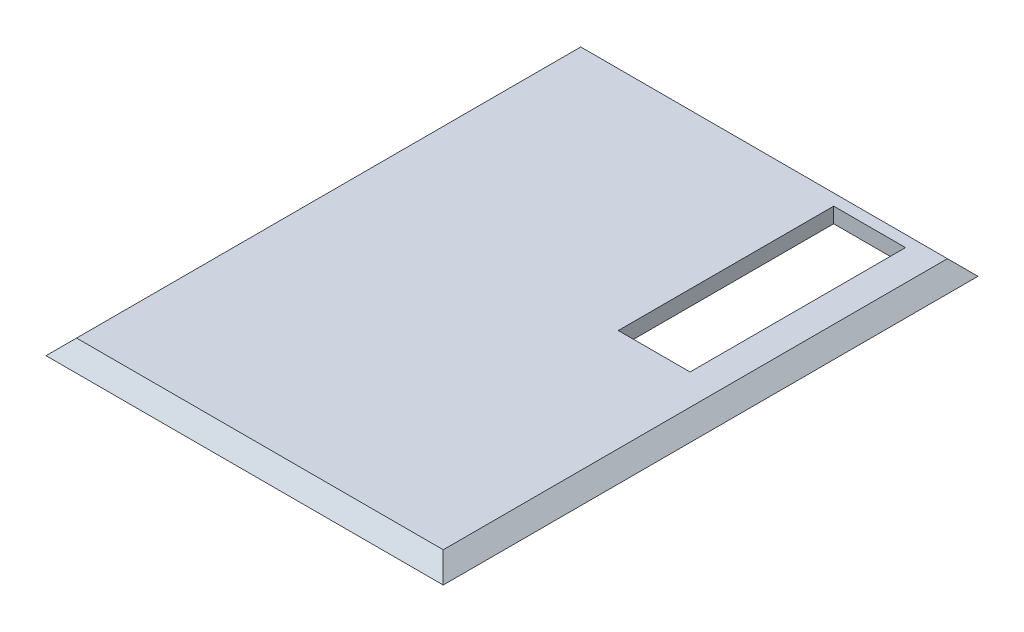
ISO-10303-21;
HEADER;
FILE_DESCRIPTION(('STEP AP214'),'2;1');
FILE_NAME('part.step','',(''),(''),'','','');
FILE_SCHEMA(('AUTOMOTIVE_DESIGN { 1 0 10303 214 1 1 1 1 }'));
ENDSEC;
DATA;
#1=APPLICATION_CONTEXT('core data for automotive mechanical design processes');
#2=APPLICATION_PROTOCOL_DEFINITION('international standard','automotive_design',2000,#1);
#3=PRODUCT_CONTEXT('',#1,'mechanical');
#4=PRODUCT('Part','Part','',(#3));
#5=PRODUCT_RELATED_PRODUCT_CATEGORY('part','',(#4));
#6=PRODUCT_DEFINITION_FORMATION('','',#4);
#7=PRODUCT_DEFINITION_CONTEXT('part definition',#1,'design');
#8=PRODUCT_DEFINITION('design','',#6,#7);
#9=PRODUCT_DEFINITION_SHAPE('','',#8);
#10=(LENGTH_UNIT() NAMED_UNIT(*) SI_UNIT(.MILLI.,.METRE.));
#11=(NAMED_UNIT(*) PLANE_ANGLE_UNIT() SI_UNIT($,.RADIAN.));
#12=(NAMED_UNIT(*) SI_UNIT($,.STERADIAN.) SOLID_ANGLE_UNIT());
#13=UNCERTAINTY_MEASURE_WITH_UNIT(LENGTH_MEASURE(1.E-05),#10,'distance_accuracy_value','');
#14=(GEOMETRIC_REPRESENTATION_CONTEXT(3) GLOBAL_UNCERTAINTY_ASSIGNED_CONTEXT((#13)) GLOBAL_UNIT_ASSIGNED_CONTEXT((#10,
#11,#12)) REPRESENTATION_CONTEXT('',''));
#15=CARTESIAN_POINT('',(0.,0.,0.));
#16=DIRECTION('',(0.,0.,1.));
#17=DIRECTION('',(1.,0.,0.));
#18=AXIS2_PLACEMENT_3D('',#15,#16,#17);
#19=CARTESIAN_POINT('',(0.,0.,0.));
#20=DIRECTION('',(0.,-1.,0.));
#21=DIRECTION('',(0.,0.,-1.));
#22=AXIS2_PLACEMENT_3D('',#19,#20,#21);
#23=PLANE('',#22);
#24=DIRECTION('',(0.,0.,-1.));
#25=VECTOR('',#24,1.);
#26=CARTESIAN_POINT('',(65.,0.,87.5));
#27=LINE('',#26,#25);
#28=CARTESIAN_POINT('',(65.,0.,87.5));
#29=VERTEX_POINT('',#28);
#30=CARTESIAN_POINT('',(65.,0.,-87.5));
#31=VERTEX_POINT('',#30);
#32=EDGE_CURVE('E218',#29,#31,#27,.T.);
#33=ORIENTED_EDGE('',*,*,#32,.F.);
#34=DIRECTION('',(1.,0.,0.));
#35=VECTOR('',#34,1.);
#36=CARTESIAN_POINT('',(-65.,0.,87.5));
#37=LINE('',#36,#35);
#38=CARTESIAN_POINT('',(-65.,0.,87.5));
#39=VERTEX_POINT('',#38);
#40=EDGE_CURVE('E228',#39,#29,#37,.T.);
#41=ORIENTED_EDGE('',*,*,#40,.F.);
#42=DIRECTION('',(0.,0.,1.));
#43=VECTOR('',#42,1.);
#44=CARTESIAN_POINT('',(-65.,0.,87.5));
#45=LINE('',#44,#43);
#46=CARTESIAN_POINT('',(-65.,0.,-87.5));
#47=VERTEX_POINT('',#46);
#48=EDGE_CURVE('E225',#47,#39,#45,.T.);
#49=ORIENTED_EDGE('',*,*,#48,.F.);
#50=DIRECTION('',(-1.,0.,0.));
#51=VECTOR('',#50,1.);
#52=CARTESIAN_POINT('',(-65.,0.,-87.5));
#53=LINE('',#52,#51);
#54=EDGE_CURVE('E221',#31,#47,#53,.T.);
#55=ORIENTED_EDGE('',*,*,#54,.F.);
#56=EDGE_LOOP('',(#33,#41,#49,#55));
#57=FACE_BOUND('',#56,.T.);
#58=DIRECTION('',(-1.,0.,0.));
#59=VECTOR('',#58,1.);
#60=CARTESIAN_POINT('',(0.,0.,-5.));
#61=LINE('',#60,#59);
#62=CARTESIAN_POINT('',(0.5,0.,-5.));
#63=VERTEX_POINT('',#62);
#64=CARTESIAN_POINT('',(-0.5,0.,-5.));
#65=VERTEX_POINT('',#64);
#66=EDGE_CURVE('E211',#63,#65,#61,.T.);
#67=ORIENTED_EDGE('',*,*,#66,.T.);
#68=CARTESIAN_POINT('',(-0.5,0.,-4.));
#69=DIRECTION('',(0.,-1.,0.));
#70=DIRECTION('',(0.,0.,-1.));
#71=AXIS2_PLACEMENT_3D('',#68,#69,#70);
#72=CIRCLE('',#71,1.);
#73=CARTESIAN_POINT('',(-1.5,0.,-4.));
#74=VERTEX_POINT('',#73);
#75=EDGE_CURVE('E310',#65,#74,#72,.F.);
#76=ORIENTED_EDGE('',*,*,#75,.T.);
#77=DIRECTION('',(0.,0.,1.));
#78=VECTOR('',#77,1.);
#79=CARTESIAN_POINT('',(-1.5,0.,0.));
#80=LINE('',#79,#78);
#81=CARTESIAN_POINT('',(-1.5,0.,4.));
#82=VERTEX_POINT('',#81);
#83=EDGE_CURVE('E207',#74,#82,#80,.T.);
#84=ORIENTED_EDGE('',*,*,#83,.T.);
#85=CARTESIAN_POINT('',(-0.5,0.,4.));
#86=DIRECTION('',(0.,-1.,0.));
#87=DIRECTION('',(0.,0.,-1.));
#88=AXIS2_PLACEMENT_3D('',#85,#86,#87);
#89=CIRCLE('',#88,1.);
#90=CARTESIAN_POINT('',(-0.5,0.,5.));
#91=VERTEX_POINT('',#90);
#92=EDGE_CURVE('E52',#82,#91,#89,.F.);
#93=ORIENTED_EDGE('',*,*,#92,.T.);
#94=DIRECTION('',(-1.,0.,0.));
#95=VECTOR('',#94,1.);
#96=CARTESIAN_POINT('',(0.,0.,5.));
#97=LINE('',#96,#95);
#98=CARTESIAN_POINT('',(0.5,0.,5.));
#99=VERTEX_POINT('',#98);
#100=EDGE_CURVE('E204',#99,#91,#97,.T.);
#101=ORIENTED_EDGE('',*,*,#100,.F.);
#102=CARTESIAN_POINT('',(0.5,0.,4.));
#103=DIRECTION('',(0.,-1.,0.));
#104=DIRECTION('',(0.,0.,-1.));
#105=AXIS2_PLACEMENT_3D('',#102,#103,#104);
#106=CIRCLE('',#105,1.);
#107=CARTESIAN_POINT('',(1.5,0.,4.));
#108=VERTEX_POINT('',#107);
#109=EDGE_CURVE('E11',#99,#108,#106,.F.);
#110=ORIENTED_EDGE('',*,*,#109,.T.);
#111=DIRECTION('',(0.,0.,1.));
#112=VECTOR('',#111,1.);
#113=CARTESIAN_POINT('',(1.5,0.,0.));
#114=LINE('',#113,#112);
#115=CARTESIAN_POINT('',(1.5,0.,-4.));
#116=VERTEX_POINT('',#115);
#117=EDGE_CURVE('E214',#116,#108,#114,.T.);
#118=ORIENTED_EDGE('',*,*,#117,.F.);
#119=CARTESIAN_POINT('',(0.5,0.,-4.));
#120=DIRECTION('',(0.,-1.,0.));
#121=DIRECTION('',(0.,0.,-1.));
#122=AXIS2_PLACEMENT_3D('',#119,#120,#121);
#123=CIRCLE('',#122,1.);
#124=EDGE_CURVE('E308',#116,#63,#123,.F.);
#125=ORIENTED_EDGE('',*,*,#124,.T.);
#126=EDGE_LOOP('',(#67,#76,#84,#93,#101,#110,#118,#125));
#127=FACE_BOUND('',#126,.T.);
#128=DIRECTION('',(0.,0.,-1.));
#129=VECTOR('',#128,1.);
#130=CARTESIAN_POINT('',(50.,0.,0.));
#131=LINE('',#130,#129);
#132=CARTESIAN_POINT('',(50.,0.,-8.275));
#133=VERTEX_POINT('',#132);
#134=CARTESIAN_POINT('',(50.,0.,-78.775));
#135=VERTEX_POINT('',#134);
#136=EDGE_CURVE('E195',#133,#135,#131,.T.);
#137=ORIENTED_EDGE('',*,*,#136,.T.);
#138=DIRECTION('',(-1.,0.,0.));
#139=VECTOR('',#138,1.);
#140=CARTESIAN_POINT('',(0.,0.,-78.775));
#141=LINE('',#140,#139);
#142=CARTESIAN_POINT('',(26.5,0.,-78.775));
#143=VERTEX_POINT('',#142);
#144=EDGE_CURVE('E60',#135,#143,#141,.T.);
#145=ORIENTED_EDGE('',*,*,#144,.T.);
#146=DIRECTION('',(0.,0.,-1.));
#147=VECTOR('',#146,1.);
#148=CARTESIAN_POINT('',(26.5,0.,0.));
#149=LINE('',#148,#147);
#150=CARTESIAN_POINT('',(26.5,0.,-8.275));
#151=VERTEX_POINT('',#150);
#152=EDGE_CURVE('E186',#151,#143,#149,.T.);
#153=ORIENTED_EDGE('',*,*,#152,.F.);
#154=DIRECTION('',(-1.,0.,0.));
#155=VECTOR('',#154,1.);
#156=CARTESIAN_POINT('',(0.,0.,-8.27500000000001));
#157=LINE('',#156,#155);
#158=EDGE_CURVE('E189',#133,#151,#157,.T.);
#159=ORIENTED_EDGE('',*,*,#158,.F.);
#160=EDGE_LOOP('',(#137,#145,#153,#159));
#161=FACE_BOUND('',#160,.T.);
#162=ADVANCED_FACE('F43',(#57,#127,#161),#23,.T.);
#163=CARTESIAN_POINT('',(0.,5.,0.));
#164=DIRECTION('',(0.,-1.,0.));
#165=DIRECTION('',(0.,0.,-1.));
#166=AXIS2_PLACEMENT_3D('',#163,#164,#165);
#167=PLANE('',#166);
#168=DIRECTION('',(1.,0.,0.));
#169=VECTOR('',#168,1.);
#170=CARTESIAN_POINT('',(0.,5.,82.5));
#171=LINE('',#170,#169);
#172=CARTESIAN_POINT('',(-60.,5.,82.5));
#173=VERTEX_POINT('',#172);
#174=CARTESIAN_POINT('',(60.,5.,82.5));
#175=VERTEX_POINT('',#174);
#176=EDGE_CURVE('E231',#173,#175,#171,.T.);
#177=ORIENTED_EDGE('',*,*,#176,.T.);
#178=DIRECTION('',(0.,0.,-1.));
#179=VECTOR('',#178,1.);
#180=CARTESIAN_POINT('',(60.,5.,0.));
#181=LINE('',#180,#179);
#182=CARTESIAN_POINT('',(60.,5.,-82.5));
#183=VERTEX_POINT('',#182);
#184=EDGE_CURVE('E237',#175,#183,#181,.T.);
#185=ORIENTED_EDGE('',*,*,#184,.T.);
#186=DIRECTION('',(-1.,0.,0.));
#187=VECTOR('',#186,1.);
#188=CARTESIAN_POINT('',(0.,5.,-82.5));
#189=LINE('',#188,#187);
#190=CARTESIAN_POINT('',(-60.,5.,-82.5));
#191=VERTEX_POINT('',#190);
#192=EDGE_CURVE('E235',#183,#191,#189,.T.);
#193=ORIENTED_EDGE('',*,*,#192,.T.);
#194=DIRECTION('',(0.,0.,1.));
#195=VECTOR('',#194,1.);
#196=CARTESIAN_POINT('',(-60.,5.,0.));
#197=LINE('',#196,#195);
#198=EDGE_CURVE('E233',#191,#173,#197,.T.);
#199=ORIENTED_EDGE('',*,*,#198,.T.);
#200=EDGE_LOOP('',(#177,#185,#193,#199));
#201=FACE_BOUND('',#200,.T.);
#202=DIRECTION('',(-1.,0.,0.));
#203=VECTOR('',#202,1.);
#204=CARTESIAN_POINT('',(0.,5.,-78.775));
#205=LINE('',#204,#203);
#206=CARTESIAN_POINT('',(50.,5.,-78.775));
#207=VERTEX_POINT('',#206);
#208=CARTESIAN_POINT('',(26.5,5.,-78.775));
#209=VERTEX_POINT('',#208);
#210=EDGE_CURVE('E177',#207,#209,#205,.T.);
#211=ORIENTED_EDGE('',*,*,#210,.F.);
#212=DIRECTION('',(0.,0.,-1.));
#213=VECTOR('',#212,1.);
#214=CARTESIAN_POINT('',(50.,5.,0.));
#215=LINE('',#214,#213);
#216=CARTESIAN_POINT('',(50.,5.,-8.275));
#217=VERTEX_POINT('',#216);
#218=EDGE_CURVE('E169',#217,#207,#215,.T.);
#219=ORIENTED_EDGE('',*,*,#218,.F.);
#220=DIRECTION('',(-1.,0.,0.));
#221=VECTOR('',#220,1.);
#222=CARTESIAN_POINT('',(0.,5.,-8.27500000000001));
#223=LINE('',#222,#221);
#224=CARTESIAN_POINT('',(26.5,5.,-8.275));
#225=VERTEX_POINT('',#224);
#226=EDGE_CURVE('E68',#217,#225,#223,.T.);
#227=ORIENTED_EDGE('',*,*,#226,.T.);
#228=DIRECTION('',(0.,0.,-1.));
#229=VECTOR('',#228,1.);
#230=CARTESIAN_POINT('',(26.5,5.,0.));
#231=LINE('',#230,#229);
#232=EDGE_CURVE('E181',#225,#209,#231,.T.);
#233=ORIENTED_EDGE('',*,*,#232,.T.);
#234=EDGE_LOOP('',(#211,#219,#227,#233));
#235=FACE_BOUND('',#234,.T.);
#236=ADVANCED_FACE('F184',(#201,#235),#167,.F.);
#237=CARTESIAN_POINT('',(-60.,5.,0.));
#238=DIRECTION('',(0.707106781186549,-0.707106781186546,0.));
#239=DIRECTION('',(0.,0.,1.));
#240=AXIS2_PLACEMENT_3D('',#237,#238,#239);
#241=PLANE('',#240);
#242=DIRECTION('',(-0.577350269189625,-0.577350269189628,-0.577350269189625));
#243=VECTOR('',#242,1.);
#244=CARTESIAN_POINT('',(-32.5000000000001,32.5000000000001,-55.0000000000001));
#245=LINE('',#244,#243);
#246=EDGE_CURVE('E244',#47,#191,#245,.F.);
#247=ORIENTED_EDGE('',*,*,#246,.F.);
#248=ORIENTED_EDGE('',*,*,#48,.T.);
#249=DIRECTION('',(-0.577350269189625,-0.577350269189628,0.577350269189625));
#250=VECTOR('',#249,1.);
#251=CARTESIAN_POINT('',(-40.0000000000001,25.,62.5000000000001));
#252=LINE('',#251,#250);
#253=EDGE_CURVE('E222',#173,#39,#252,.T.);
#254=ORIENTED_EDGE('',*,*,#253,.F.);
#255=ORIENTED_EDGE('',*,*,#198,.F.);
#256=EDGE_LOOP('',(#247,#248,#254,#255));
#257=FACE_BOUND('',#256,.T.);
#258=ADVANCED_FACE('F401',(#257),#241,.F.);
#259=CARTESIAN_POINT('',(0.,5.,82.5));
#260=DIRECTION('',(0.,-0.707106781186546,-0.707106781186549));
#261=DIRECTION('',(1.,0.,0.));
#262=AXIS2_PLACEMENT_3D('',#259,#260,#261);
#263=PLANE('',#262);
#264=ORIENTED_EDGE('',*,*,#253,.T.);
#265=ORIENTED_EDGE('',*,*,#40,.T.);
#266=DIRECTION('',(-0.577350269189625,0.577350269189628,-0.577350269189625));
#267=VECTOR('',#266,1.);
#268=CARTESIAN_POINT('',(40.0000000000001,25.,62.5000000000001));
#269=LINE('',#268,#267);
#270=EDGE_CURVE('E242',#175,#29,#269,.F.);
#271=ORIENTED_EDGE('',*,*,#270,.F.);
#272=ORIENTED_EDGE('',*,*,#176,.F.);
#273=EDGE_LOOP('',(#264,#265,#271,#272));
#274=FACE_BOUND('',#273,.T.);
#275=ADVANCED_FACE('F419',(#274),#263,.F.);
#276=CARTESIAN_POINT('',(0.,5.,-82.5));
#277=DIRECTION('',(0.,-0.707106781186546,0.707106781186549));
#278=DIRECTION('',(-1.,0.,0.));
#279=AXIS2_PLACEMENT_3D('',#276,#277,#278);
#280=PLANE('',#279);
#281=ORIENTED_EDGE('',*,*,#246,.T.);
#282=ORIENTED_EDGE('',*,*,#192,.F.);
#283=DIRECTION('',(0.577350269189625,-0.577350269189628,-0.577350269189625));
#284=VECTOR('',#283,1.);
#285=CARTESIAN_POINT('',(40.0000000000001,25.,-62.5000000000001));
#286=LINE('',#285,#284);
#287=EDGE_CURVE('E217',#31,#183,#286,.F.);
#288=ORIENTED_EDGE('',*,*,#287,.F.);
#289=ORIENTED_EDGE('',*,*,#54,.T.);
#290=EDGE_LOOP('',(#281,#282,#288,#289));
#291=FACE_BOUND('',#290,.T.);
#292=ADVANCED_FACE('F412',(#291),#280,.F.);
#293=CARTESIAN_POINT('',(60.,5.,0.));
#294=DIRECTION('',(-0.707106781186549,-0.707106781186546,0.));
#295=DIRECTION('',(0.,0.,-1.));
#296=AXIS2_PLACEMENT_3D('',#293,#294,#295);
#297=PLANE('',#296);
#298=ORIENTED_EDGE('',*,*,#270,.T.);
#299=ORIENTED_EDGE('',*,*,#32,.T.);
#300=ORIENTED_EDGE('',*,*,#287,.T.);
#301=ORIENTED_EDGE('',*,*,#184,.F.);
#302=EDGE_LOOP('',(#298,#299,#300,#301));
#303=FACE_BOUND('',#302,.T.);
#304=ADVANCED_FACE('F393',(#303),#297,.F.);
#305=CARTESIAN_POINT('',(0.,-5.,5.));
#306=DIRECTION('',(0.,0.,-1.));
#307=DIRECTION('',(-1.,0.,0.));
#308=AXIS2_PLACEMENT_3D('',#305,#306,#307);
#309=PLANE('',#308);
#310=ORIENTED_EDGE('',*,*,#100,.T.);
#311=DIRECTION('',(0.,1.,0.));
#312=VECTOR('',#311,1.);
#313=CARTESIAN_POINT('',(-0.5,-4.,5.));
#314=LINE('',#313,#312);
#315=CARTESIAN_POINT('',(-0.5,-4.,5.));
#316=VERTEX_POINT('',#315);
#317=EDGE_CURVE('E306',#91,#316,#314,.F.);
#318=ORIENTED_EDGE('',*,*,#317,.T.);
#319=DIRECTION('',(-1.,0.,0.));
#320=VECTOR('',#319,1.);
#321=CARTESIAN_POINT('',(1.5,-4.,5.));
#322=LINE('',#321,#320);
#323=CARTESIAN_POINT('',(0.5,-4.,5.));
#324=VERTEX_POINT('',#323);
#325=EDGE_CURVE('E269',#316,#324,#322,.F.);
#326=ORIENTED_EDGE('',*,*,#325,.T.);
#327=DIRECTION('',(0.,1.,0.));
#328=VECTOR('',#327,1.);
#329=CARTESIAN_POINT('',(0.5,-5.,5.));
#330=LINE('',#329,#328);
#331=EDGE_CURVE('E304',#324,#99,#330,.T.);
#332=ORIENTED_EDGE('',*,*,#331,.T.);
#333=EDGE_LOOP('',(#310,#318,#326,#332));
#334=FACE_BOUND('',#333,.T.);
#335=ADVANCED_FACE('F331',(#334),#309,.F.);
#336=CARTESIAN_POINT('',(-1.5,-5.,0.));
#337=DIRECTION('',(-1.,0.,0.));
#338=DIRECTION('',(0.,0.,1.));
#339=AXIS2_PLACEMENT_3D('',#336,#337,#338);
#340=PLANE('',#339);
#341=ORIENTED_EDGE('',*,*,#83,.F.);
#342=DIRECTION('',(0.,1.,0.));
#343=VECTOR('',#342,1.);
#344=CARTESIAN_POINT('',(-1.5,-5.,-4.));
#345=LINE('',#344,#343);
#346=CARTESIAN_POINT('',(-1.5,-4.,-4.));
#347=VERTEX_POINT('',#346);
#348=EDGE_CURVE('E302',#74,#347,#345,.F.);
#349=ORIENTED_EDGE('',*,*,#348,.T.);
#350=DIRECTION('',(0.,0.,1.));
#351=VECTOR('',#350,1.);
#352=CARTESIAN_POINT('',(-1.5,-4.,0.));
#353=LINE('',#352,#351);
#354=CARTESIAN_POINT('',(-1.5,-4.,4.));
#355=VERTEX_POINT('',#354);
#356=EDGE_CURVE('E266',#347,#355,#353,.T.);
#357=ORIENTED_EDGE('',*,*,#356,.T.);
#358=DIRECTION('',(0.,1.,0.));
#359=VECTOR('',#358,1.);
#360=CARTESIAN_POINT('',(-1.5,0.,4.));
#361=LINE('',#360,#359);
#362=EDGE_CURVE('E300',#355,#82,#361,.T.);
#363=ORIENTED_EDGE('',*,*,#362,.T.);
#364=EDGE_LOOP('',(#341,#349,#357,#363));
#365=FACE_BOUND('',#364,.T.);
#366=ADVANCED_FACE('F385',(#365),#340,.T.);
#367=CARTESIAN_POINT('',(0.,-5.,-5.));
#368=DIRECTION('',(0.,0.,-1.));
#369=DIRECTION('',(-1.,0.,0.));
#370=AXIS2_PLACEMENT_3D('',#367,#368,#369);
#371=PLANE('',#370);
#372=ORIENTED_EDGE('',*,*,#66,.F.);
#373=DIRECTION('',(0.,1.,0.));
#374=VECTOR('',#373,1.);
#375=CARTESIAN_POINT('',(0.5,-4.,-5.));
#376=LINE('',#375,#374);
#377=CARTESIAN_POINT('',(0.5,-4.,-5.));
#378=VERTEX_POINT('',#377);
#379=EDGE_CURVE('E298',#63,#378,#376,.F.);
#380=ORIENTED_EDGE('',*,*,#379,.T.);
#381=DIRECTION('',(-1.,0.,0.));
#382=VECTOR('',#381,1.);
#383=CARTESIAN_POINT('',(0.,-4.,-5.));
#384=LINE('',#383,#382);
#385=CARTESIAN_POINT('',(-0.5,-4.,-5.));
#386=VERTEX_POINT('',#385);
#387=EDGE_CURVE('E263',#378,#386,#384,.T.);
#388=ORIENTED_EDGE('',*,*,#387,.T.);
#389=DIRECTION('',(0.,1.,0.));
#390=VECTOR('',#389,1.);
#391=CARTESIAN_POINT('',(-0.5,-5.,-5.));
#392=LINE('',#391,#390);
#393=EDGE_CURVE('E296',#386,#65,#392,.T.);
#394=ORIENTED_EDGE('',*,*,#393,.T.);
#395=EDGE_LOOP('',(#372,#380,#388,#394));
#396=FACE_BOUND('',#395,.T.);
#397=ADVANCED_FACE('F368',(#396),#371,.T.);
#398=CARTESIAN_POINT('',(1.5,-5.,0.));
#399=DIRECTION('',(-1.,0.,0.));
#400=DIRECTION('',(0.,0.,1.));
#401=AXIS2_PLACEMENT_3D('',#398,#399,#400);
#402=PLANE('',#401);
#403=DIRECTION('',(0.,0.,1.));
#404=VECTOR('',#403,1.);
#405=CARTESIAN_POINT('',(1.5,-4.,-5.));
#406=LINE('',#405,#404);
#407=CARTESIAN_POINT('',(1.5,-4.,4.));
#408=VERTEX_POINT('',#407);
#409=CARTESIAN_POINT('',(1.5,-4.,-4.));
#410=VERTEX_POINT('',#409);
#411=EDGE_CURVE('E260',#408,#410,#406,.F.);
#412=ORIENTED_EDGE('',*,*,#411,.T.);
#413=DIRECTION('',(0.,1.,0.));
#414=VECTOR('',#413,1.);
#415=CARTESIAN_POINT('',(1.5,0.,-4.));
#416=LINE('',#415,#414);
#417=EDGE_CURVE('E294',#410,#116,#416,.T.);
#418=ORIENTED_EDGE('',*,*,#417,.T.);
#419=ORIENTED_EDGE('',*,*,#117,.T.);
#420=DIRECTION('',(0.,1.,0.));
#421=VECTOR('',#420,1.);
#422=CARTESIAN_POINT('',(1.5,-5.,4.));
#423=LINE('',#422,#421);
#424=EDGE_CURVE('E292',#108,#408,#423,.F.);
#425=ORIENTED_EDGE('',*,*,#424,.T.);
#426=EDGE_LOOP('',(#412,#418,#419,#425));
#427=FACE_BOUND('',#426,.T.);
#428=ADVANCED_FACE('F364',(#427),#402,.F.);
#429=CARTESIAN_POINT('',(0.,-5.,0.));
#430=DIRECTION('',(0.,-1.,0.));
#431=DIRECTION('',(0.,0.,-1.));
#432=AXIS2_PLACEMENT_3D('',#429,#430,#431);
#433=PLANE('',#432);
#434=DIRECTION('',(-1.,0.,0.));
#435=VECTOR('',#434,1.);
#436=CARTESIAN_POINT('',(0.,-5.,-4.));
#437=LINE('',#436,#435);
#438=CARTESIAN_POINT('',(-0.5,-5.,-4.));
#439=VERTEX_POINT('',#438);
#440=CARTESIAN_POINT('',(0.5,-5.,-4.));
#441=VERTEX_POINT('',#440);
#442=EDGE_CURVE('E254',#439,#441,#437,.F.);
#443=ORIENTED_EDGE('',*,*,#442,.T.);
#444=DIRECTION('',(0.,0.,1.));
#445=VECTOR('',#444,1.);
#446=CARTESIAN_POINT('',(0.5,-5.,5.));
#447=LINE('',#446,#445);
#448=CARTESIAN_POINT('',(0.5,-5.,4.));
#449=VERTEX_POINT('',#448);
#450=EDGE_CURVE('E257',#441,#449,#447,.T.);
#451=ORIENTED_EDGE('',*,*,#450,.T.);
#452=DIRECTION('',(-1.,0.,0.));
#453=VECTOR('',#452,1.);
#454=CARTESIAN_POINT('',(-1.5,-5.,4.));
#455=LINE('',#454,#453);
#456=CARTESIAN_POINT('',(-0.5,-5.,4.));
#457=VERTEX_POINT('',#456);
#458=EDGE_CURVE('E240',#449,#457,#455,.T.);
#459=ORIENTED_EDGE('',*,*,#458,.T.);
#460=DIRECTION('',(0.,0.,1.));
#461=VECTOR('',#460,1.);
#462=CARTESIAN_POINT('',(-0.5,-5.,0.));
#463=LINE('',#462,#461);
#464=EDGE_CURVE('E251',#457,#439,#463,.F.);
#465=ORIENTED_EDGE('',*,*,#464,.T.);
#466=EDGE_LOOP('',(#443,#451,#459,#465));
#467=FACE_BOUND('',#466,.T.);
#468=ADVANCED_FACE('F348',(#467),#433,.T.);
#469=CARTESIAN_POINT('',(-0.5,-4.,0.));
#470=DIRECTION('',(0.,0.,1.));
#471=DIRECTION('',(1.,0.,0.));
#472=AXIS2_PLACEMENT_3D('',#469,#470,#471);
#473=CYLINDRICAL_SURFACE('',#472,1.);
#474=ORIENTED_EDGE('',*,*,#356,.F.);
#475=CARTESIAN_POINT('',(-0.5,-4.,-4.));
#476=DIRECTION('',(0.,0.,1.));
#477=DIRECTION('',(1.,0.,0.));
#478=AXIS2_PLACEMENT_3D('',#475,#476,#477);
#479=CIRCLE('',#478,1.);
#480=EDGE_CURVE('E285',#347,#439,#479,.T.);
#481=ORIENTED_EDGE('',*,*,#480,.T.);
#482=ORIENTED_EDGE('',*,*,#464,.F.);
#483=CARTESIAN_POINT('',(-0.5,-4.,4.));
#484=DIRECTION('',(0.,0.,1.));
#485=DIRECTION('',(1.,0.,0.));
#486=AXIS2_PLACEMENT_3D('',#483,#484,#485);
#487=CIRCLE('',#486,1.);
#488=EDGE_CURVE('E283',#457,#355,#487,.F.);
#489=ORIENTED_EDGE('',*,*,#488,.T.);
#490=EDGE_LOOP('',(#474,#481,#482,#489));
#491=FACE_BOUND('',#490,.T.);
#492=ADVANCED_FACE('F383',(#491),#473,.T.);
#493=CARTESIAN_POINT('',(0.,-4.,-4.));
#494=DIRECTION('',(-1.,0.,0.));
#495=DIRECTION('',(0.,0.,1.));
#496=AXIS2_PLACEMENT_3D('',#493,#494,#495);
#497=CYLINDRICAL_SURFACE('',#496,1.);
#498=ORIENTED_EDGE('',*,*,#387,.F.);
#499=CARTESIAN_POINT('',(0.5,-4.,-4.));
#500=DIRECTION('',(-1.,0.,0.));
#501=DIRECTION('',(0.,0.,1.));
#502=AXIS2_PLACEMENT_3D('',#499,#500,#501);
#503=CIRCLE('',#502,1.);
#504=EDGE_CURVE('E281',#378,#441,#503,.T.);
#505=ORIENTED_EDGE('',*,*,#504,.T.);
#506=ORIENTED_EDGE('',*,*,#442,.F.);
#507=CARTESIAN_POINT('',(-0.5,-4.,-4.));
#508=DIRECTION('',(-1.,0.,0.));
#509=DIRECTION('',(0.,0.,1.));
#510=AXIS2_PLACEMENT_3D('',#507,#508,#509);
#511=CIRCLE('',#510,1.);
#512=EDGE_CURVE('E278',#439,#386,#511,.F.);
#513=ORIENTED_EDGE('',*,*,#512,.T.);
#514=EDGE_LOOP('',(#498,#505,#506,#513));
#515=FACE_BOUND('',#514,.T.);
#516=ADVANCED_FACE('F377',(#515),#497,.T.);
#517=CARTESIAN_POINT('',(0.,-4.,4.));
#518=DIRECTION('',(1.,0.,0.));
#519=DIRECTION('',(0.,0.,-1.));
#520=AXIS2_PLACEMENT_3D('',#517,#518,#519);
#521=CYLINDRICAL_SURFACE('',#520,1.);
#522=ORIENTED_EDGE('',*,*,#325,.F.);
#523=CARTESIAN_POINT('',(-0.5,-4.,4.));
#524=DIRECTION('',(1.,0.,0.));
#525=DIRECTION('',(0.,0.,-1.));
#526=AXIS2_PLACEMENT_3D('',#523,#524,#525);
#527=CIRCLE('',#526,1.);
#528=EDGE_CURVE('E289',#316,#457,#527,.T.);
#529=ORIENTED_EDGE('',*,*,#528,.T.);
#530=ORIENTED_EDGE('',*,*,#458,.F.);
#531=CARTESIAN_POINT('',(0.5,-4.,4.));
#532=DIRECTION('',(1.,0.,0.));
#533=DIRECTION('',(0.,0.,-1.));
#534=AXIS2_PLACEMENT_3D('',#531,#532,#533);
#535=CIRCLE('',#534,1.);
#536=EDGE_CURVE('E287',#449,#324,#535,.F.);
#537=ORIENTED_EDGE('',*,*,#536,.T.);
#538=EDGE_LOOP('',(#522,#529,#530,#537));
#539=FACE_BOUND('',#538,.T.);
#540=ADVANCED_FACE('F343',(#539),#521,.T.);
#541=CARTESIAN_POINT('',(0.5,-4.,0.));
#542=DIRECTION('',(0.,0.,-1.));
#543=DIRECTION('',(-1.,0.,0.));
#544=AXIS2_PLACEMENT_3D('',#541,#542,#543);
#545=CYLINDRICAL_SURFACE('',#544,1.);
#546=ORIENTED_EDGE('',*,*,#450,.F.);
#547=CARTESIAN_POINT('',(0.5,-4.,-4.));
#548=DIRECTION('',(0.,0.,-1.));
#549=DIRECTION('',(-1.,0.,0.));
#550=AXIS2_PLACEMENT_3D('',#547,#548,#549);
#551=CIRCLE('',#550,1.);
#552=EDGE_CURVE('E275',#441,#410,#551,.F.);
#553=ORIENTED_EDGE('',*,*,#552,.T.);
#554=ORIENTED_EDGE('',*,*,#411,.F.);
#555=CARTESIAN_POINT('',(0.5,-4.,4.));
#556=DIRECTION('',(0.,0.,-1.));
#557=DIRECTION('',(-1.,0.,0.));
#558=AXIS2_PLACEMENT_3D('',#555,#556,#557);
#559=CIRCLE('',#558,1.);
#560=EDGE_CURVE('E272',#408,#449,#559,.T.);
#561=ORIENTED_EDGE('',*,*,#560,.T.);
#562=EDGE_LOOP('',(#546,#553,#554,#561));
#563=FACE_BOUND('',#562,.T.);
#564=ADVANCED_FACE('F352',(#563),#545,.T.);
#565=CARTESIAN_POINT('',(0.5,-5.,-4.));
#566=DIRECTION('',(0.,-1.,0.));
#567=DIRECTION('',(0.,0.,-1.));
#568=AXIS2_PLACEMENT_3D('',#565,#566,#567);
#569=CYLINDRICAL_SURFACE('',#568,1.);
#570=ORIENTED_EDGE('',*,*,#124,.F.);
#571=ORIENTED_EDGE('',*,*,#417,.F.);
#572=CARTESIAN_POINT('',(0.5,-4.,-4.));
#573=DIRECTION('',(0.,-1.,0.));
#574=DIRECTION('',(0.,0.,-1.));
#575=AXIS2_PLACEMENT_3D('',#572,#573,#574);
#576=CIRCLE('',#575,1.);
#577=EDGE_CURVE('E208',#378,#410,#576,.T.);
#578=ORIENTED_EDGE('',*,*,#577,.F.);
#579=ORIENTED_EDGE('',*,*,#379,.F.);
#580=EDGE_LOOP('',(#570,#571,#578,#579));
#581=FACE_BOUND('',#580,.T.);
#582=ADVANCED_FACE('F362',(#581),#569,.T.);
#583=CARTESIAN_POINT('',(0.5,-4.,-4.));
#584=DIRECTION('',(0.,0.,1.));
#585=DIRECTION('',(1.,0.,0.));
#586=AXIS2_PLACEMENT_3D('',#583,#584,#585);
#587=SPHERICAL_SURFACE('',#586,1.);
#588=ORIENTED_EDGE('',*,*,#552,.F.);
#589=ORIENTED_EDGE('',*,*,#504,.F.);
#590=ORIENTED_EDGE('',*,*,#577,.T.);
#591=EDGE_LOOP('',(#588,#589,#590));
#592=FACE_BOUND('',#591,.T.);
#593=ADVANCED_FACE('F356',(#592),#587,.T.);
#594=CARTESIAN_POINT('',(-0.5,-5.,-4.));
#595=DIRECTION('',(0.,1.,0.));
#596=DIRECTION('',(0.,0.,1.));
#597=AXIS2_PLACEMENT_3D('',#594,#595,#596);
#598=CYLINDRICAL_SURFACE('',#597,1.);
#599=ORIENTED_EDGE('',*,*,#75,.F.);
#600=ORIENTED_EDGE('',*,*,#393,.F.);
#601=CARTESIAN_POINT('',(-0.5,-4.,-4.));
#602=DIRECTION('',(0.,-1.,0.));
#603=DIRECTION('',(0.,0.,-1.));
#604=AXIS2_PLACEMENT_3D('',#601,#602,#603);
#605=CIRCLE('',#604,1.);
#606=EDGE_CURVE('E314',#347,#386,#605,.T.);
#607=ORIENTED_EDGE('',*,*,#606,.F.);
#608=ORIENTED_EDGE('',*,*,#348,.F.);
#609=EDGE_LOOP('',(#599,#600,#607,#608));
#610=FACE_BOUND('',#609,.T.);
#611=ADVANCED_FACE('F373',(#610),#598,.T.);
#612=CARTESIAN_POINT('',(-0.5,-4.,-4.));
#613=DIRECTION('',(0.,0.,1.));
#614=DIRECTION('',(1.,0.,0.));
#615=AXIS2_PLACEMENT_3D('',#612,#613,#614);
#616=SPHERICAL_SURFACE('',#615,1.);
#617=ORIENTED_EDGE('',*,*,#512,.F.);
#618=ORIENTED_EDGE('',*,*,#480,.F.);
#619=ORIENTED_EDGE('',*,*,#606,.T.);
#620=EDGE_LOOP('',(#617,#618,#619));
#621=FACE_BOUND('',#620,.T.);
#622=ADVANCED_FACE('F380',(#621),#616,.T.);
#623=CARTESIAN_POINT('',(-0.5,-5.,4.));
#624=DIRECTION('',(0.,-1.,0.));
#625=DIRECTION('',(0.,0.,-1.));
#626=AXIS2_PLACEMENT_3D('',#623,#624,#625);
#627=CYLINDRICAL_SURFACE('',#626,1.);
#628=ORIENTED_EDGE('',*,*,#92,.F.);
#629=ORIENTED_EDGE('',*,*,#362,.F.);
#630=CARTESIAN_POINT('',(-0.5,-4.,4.));
#631=DIRECTION('',(0.,-1.,0.));
#632=DIRECTION('',(0.,0.,-1.));
#633=AXIS2_PLACEMENT_3D('',#630,#631,#632);
#634=CIRCLE('',#633,1.);
#635=EDGE_CURVE('E315',#316,#355,#634,.T.);
#636=ORIENTED_EDGE('',*,*,#635,.F.);
#637=ORIENTED_EDGE('',*,*,#317,.F.);
#638=EDGE_LOOP('',(#628,#629,#636,#637));
#639=FACE_BOUND('',#638,.T.);
#640=ADVANCED_FACE('F341',(#639),#627,.T.);
#641=CARTESIAN_POINT('',(-0.5,-4.,4.));
#642=DIRECTION('',(0.,0.,1.));
#643=DIRECTION('',(1.,0.,0.));
#644=AXIS2_PLACEMENT_3D('',#641,#642,#643);
#645=SPHERICAL_SURFACE('',#644,1.);
#646=ORIENTED_EDGE('',*,*,#635,.T.);
#647=ORIENTED_EDGE('',*,*,#488,.F.);
#648=ORIENTED_EDGE('',*,*,#528,.F.);
#649=EDGE_LOOP('',(#646,#647,#648));
#650=FACE_BOUND('',#649,.T.);
#651=ADVANCED_FACE('F448',(#650),#645,.T.);
#652=CARTESIAN_POINT('',(0.5,-5.,4.));
#653=DIRECTION('',(0.,1.,0.));
#654=DIRECTION('',(0.,0.,1.));
#655=AXIS2_PLACEMENT_3D('',#652,#653,#654);
#656=CYLINDRICAL_SURFACE('',#655,1.);
#657=ORIENTED_EDGE('',*,*,#109,.F.);
#658=ORIENTED_EDGE('',*,*,#331,.F.);
#659=CARTESIAN_POINT('',(0.5,-4.,4.));
#660=DIRECTION('',(0.,-1.,0.));
#661=DIRECTION('',(0.,0.,-1.));
#662=AXIS2_PLACEMENT_3D('',#659,#660,#661);
#663=CIRCLE('',#662,1.);
#664=EDGE_CURVE('E47',#408,#324,#663,.T.);
#665=ORIENTED_EDGE('',*,*,#664,.F.);
#666=ORIENTED_EDGE('',*,*,#424,.F.);
#667=EDGE_LOOP('',(#657,#658,#665,#666));
#668=FACE_BOUND('',#667,.T.);
#669=ADVANCED_FACE('F45',(#668),#656,.T.);
#670=CARTESIAN_POINT('',(0.5,-4.,4.));
#671=DIRECTION('',(0.,0.,1.));
#672=DIRECTION('',(1.,0.,0.));
#673=AXIS2_PLACEMENT_3D('',#670,#671,#672);
#674=SPHERICAL_SURFACE('',#673,1.);
#675=ORIENTED_EDGE('',*,*,#664,.T.);
#676=ORIENTED_EDGE('',*,*,#536,.F.);
#677=ORIENTED_EDGE('',*,*,#560,.F.);
#678=EDGE_LOOP('',(#675,#676,#677));
#679=FACE_BOUND('',#678,.T.);
#680=ADVANCED_FACE('F324',(#679),#674,.T.);
#681=CARTESIAN_POINT('',(0.,5.,-78.775));
#682=DIRECTION('',(0.,0.,1.));
#683=DIRECTION('',(1.,0.,0.));
#684=AXIS2_PLACEMENT_3D('',#681,#682,#683);
#685=PLANE('',#684);
#686=ORIENTED_EDGE('',*,*,#144,.F.);
#687=DIRECTION('',(0.,-1.,0.));
#688=VECTOR('',#687,1.);
#689=CARTESIAN_POINT('',(50.,5.,-78.775));
#690=LINE('',#689,#688);
#691=EDGE_CURVE('E172',#207,#135,#690,.T.);
#692=ORIENTED_EDGE('',*,*,#691,.F.);
#693=ORIENTED_EDGE('',*,*,#210,.T.);
#694=DIRECTION('',(0.,-1.,0.));
#695=VECTOR('',#694,1.);
#696=CARTESIAN_POINT('',(26.5,5.,-78.775));
#697=LINE('',#696,#695);
#698=EDGE_CURVE('E199',#209,#143,#697,.T.);
#699=ORIENTED_EDGE('',*,*,#698,.T.);
#700=EDGE_LOOP('',(#686,#692,#693,#699));
#701=FACE_BOUND('',#700,.T.);
#702=ADVANCED_FACE('F179',(#701),#685,.T.);
#703=CARTESIAN_POINT('',(26.5,5.,0.));
#704=DIRECTION('',(-1.,0.,0.));
#705=DIRECTION('',(0.,0.,1.));
#706=AXIS2_PLACEMENT_3D('',#703,#704,#705);
#707=PLANE('',#706);
#708=ORIENTED_EDGE('',*,*,#152,.T.);
#709=ORIENTED_EDGE('',*,*,#698,.F.);
#710=ORIENTED_EDGE('',*,*,#232,.F.);
#711=DIRECTION('',(0.,-1.,0.));
#712=VECTOR('',#711,1.);
#713=CARTESIAN_POINT('',(26.5,5.,-8.275));
#714=LINE('',#713,#712);
#715=EDGE_CURVE('E201',#225,#151,#714,.T.);
#716=ORIENTED_EDGE('',*,*,#715,.T.);
#717=EDGE_LOOP('',(#708,#709,#710,#716));
#718=FACE_BOUND('',#717,.T.);
#719=ADVANCED_FACE('F457',(#718),#707,.F.);
#720=CARTESIAN_POINT('',(0.,5.,-8.27500000000001));
#721=DIRECTION('',(0.,0.,1.));
#722=DIRECTION('',(1.,0.,0.));
#723=AXIS2_PLACEMENT_3D('',#720,#721,#722);
#724=PLANE('',#723);
#725=ORIENTED_EDGE('',*,*,#158,.T.);
#726=ORIENTED_EDGE('',*,*,#715,.F.);
#727=ORIENTED_EDGE('',*,*,#226,.F.);
#728=DIRECTION('',(0.,-1.,0.));
#729=VECTOR('',#728,1.);
#730=CARTESIAN_POINT('',(50.,5.,-8.275));
#731=LINE('',#730,#729);
#732=EDGE_CURVE('E174',#217,#133,#731,.T.);
#733=ORIENTED_EDGE('',*,*,#732,.T.);
#734=EDGE_LOOP('',(#725,#726,#727,#733));
#735=FACE_BOUND('',#734,.T.);
#736=ADVANCED_FACE('F584',(#735),#724,.F.);
#737=CARTESIAN_POINT('',(50.,5.,0.));
#738=DIRECTION('',(-1.,0.,0.));
#739=DIRECTION('',(0.,0.,1.));
#740=AXIS2_PLACEMENT_3D('',#737,#738,#739);
#741=PLANE('',#740);
#742=ORIENTED_EDGE('',*,*,#136,.F.);
#743=ORIENTED_EDGE('',*,*,#732,.F.);
#744=ORIENTED_EDGE('',*,*,#218,.T.);
#745=ORIENTED_EDGE('',*,*,#691,.T.);
#746=EDGE_LOOP('',(#742,#743,#744,#745));
#747=FACE_BOUND('',#746,.T.);
#748=ADVANCED_FACE('F171',(#747),#741,.T.);
#749=CLOSED_SHELL('',(#162,#236,#258,#275,#292,#304,#335,#366,#397,#428,#468,#492,#516,#540,
#564,#582,#593,#611,#622,#640,#651,#669,#680,#702,#719,#736,#748));
#750=MANIFOLD_SOLID_BREP('B2',#749);
#751=ADVANCED_BREP_SHAPE_REPRESENTATION('',(#18,#750),#14);
#752=SHAPE_DEFINITION_REPRESENTATION(#9,#751);
ENDSEC;
END-ISO-10303-21;
